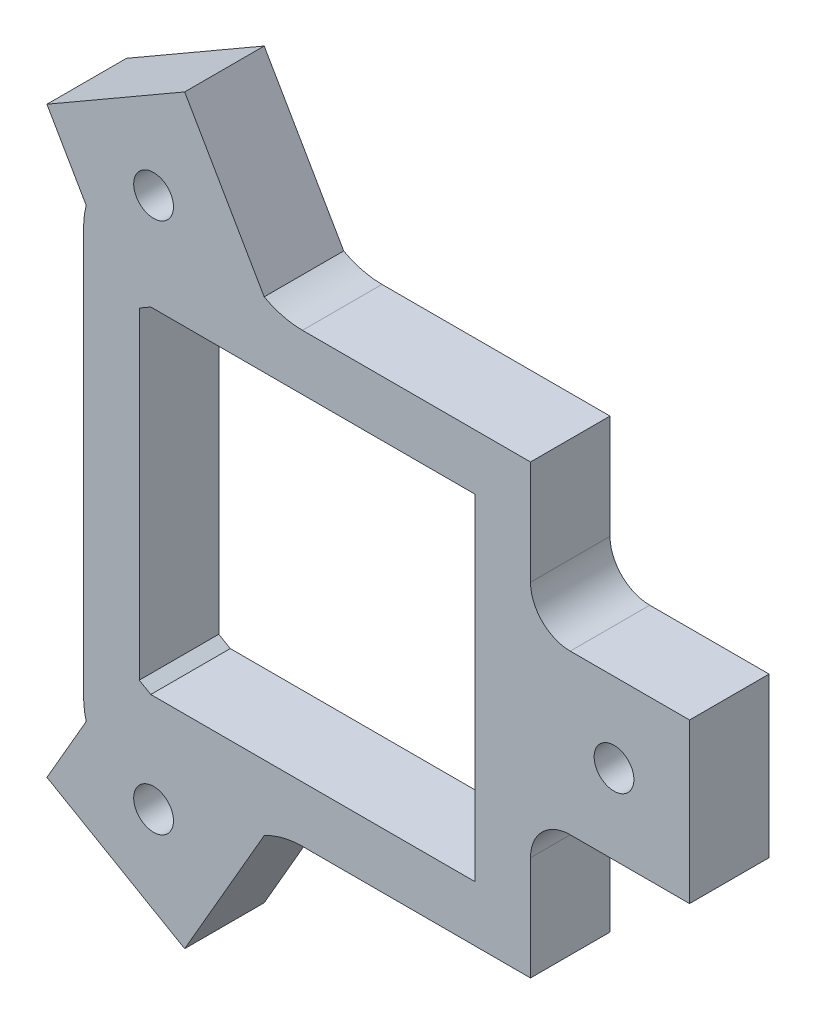
ISO-10303-21;
HEADER;
FILE_DESCRIPTION(('STEP AP214'),'2;1');
FILE_NAME('part.step','',(''),(''),'','','');
FILE_SCHEMA(('AUTOMOTIVE_DESIGN { 1 0 10303 214 1 1 1 1 }'));
ENDSEC;
DATA;
#1=APPLICATION_CONTEXT('core data for automotive mechanical design processes');
#2=APPLICATION_PROTOCOL_DEFINITION('international standard','automotive_design',2000,#1);
#3=PRODUCT_CONTEXT('',#1,'mechanical');
#4=PRODUCT('Part','Part','',(#3));
#5=PRODUCT_RELATED_PRODUCT_CATEGORY('part','',(#4));
#6=PRODUCT_DEFINITION_FORMATION('','',#4);
#7=PRODUCT_DEFINITION_CONTEXT('part definition',#1,'design');
#8=PRODUCT_DEFINITION('design','',#6,#7);
#9=PRODUCT_DEFINITION_SHAPE('','',#8);
#10=(LENGTH_UNIT() NAMED_UNIT(*) SI_UNIT(.MILLI.,.METRE.));
#11=(NAMED_UNIT(*) PLANE_ANGLE_UNIT() SI_UNIT($,.RADIAN.));
#12=(NAMED_UNIT(*) SI_UNIT($,.STERADIAN.) SOLID_ANGLE_UNIT());
#13=UNCERTAINTY_MEASURE_WITH_UNIT(LENGTH_MEASURE(1.E-05),#10,'distance_accuracy_value','');
#14=(GEOMETRIC_REPRESENTATION_CONTEXT(3) GLOBAL_UNCERTAINTY_ASSIGNED_CONTEXT((#13)) GLOBAL_UNIT_ASSIGNED_CONTEXT((#10,
#11,#12)) REPRESENTATION_CONTEXT('',''));
#15=CARTESIAN_POINT('',(0.,0.,0.));
#16=DIRECTION('',(0.,0.,1.));
#17=DIRECTION('',(1.,0.,0.));
#18=AXIS2_PLACEMENT_3D('',#15,#16,#17);
#19=CARTESIAN_POINT('',(0.,0.,10.));
#20=DIRECTION('',(1.,0.,0.));
#21=DIRECTION('',(0.,0.,-1.));
#22=AXIS2_PLACEMENT_3D('',#19,#20,#21);
#23=PLANE('',#22);
#24=DIRECTION('',(0.,-1.,0.));
#25=VECTOR('',#24,1.);
#26=CARTESIAN_POINT('',(0.,0.,0.));
#27=LINE('',#26,#25);
#28=CARTESIAN_POINT('',(0.,41.364994448556,0.));
#29=VERTEX_POINT('',#28);
#30=CARTESIAN_POINT('',(0.,0.835005551444166,0.));
#31=VERTEX_POINT('',#30);
#32=EDGE_CURVE('E336',#29,#31,#27,.T.);
#33=ORIENTED_EDGE('',*,*,#32,.F.);
#34=DIRECTION('',(0.,0.,1.));
#35=VECTOR('',#34,1.);
#36=CARTESIAN_POINT('',(0.,41.364994448556,10.));
#37=LINE('',#36,#35);
#38=CARTESIAN_POINT('',(0.,41.364994448556,10.));
#39=VERTEX_POINT('',#38);
#40=EDGE_CURVE('E248',#29,#39,#37,.T.);
#41=ORIENTED_EDGE('',*,*,#40,.T.);
#42=DIRECTION('',(0.,-1.,0.));
#43=VECTOR('',#42,1.);
#44=CARTESIAN_POINT('',(0.,0.,10.));
#45=LINE('',#44,#43);
#46=CARTESIAN_POINT('',(0.,0.835005551444166,10.));
#47=VERTEX_POINT('',#46);
#48=EDGE_CURVE('E337',#39,#47,#45,.T.);
#49=ORIENTED_EDGE('',*,*,#48,.T.);
#50=DIRECTION('',(0.,0.,-1.));
#51=VECTOR('',#50,1.);
#52=CARTESIAN_POINT('',(0.,0.835005551444163,10.));
#53=LINE('',#52,#51);
#54=EDGE_CURVE('E299',#47,#31,#53,.T.);
#55=ORIENTED_EDGE('',*,*,#54,.T.);
#56=EDGE_LOOP('',(#33,#41,#49,#55));
#57=FACE_BOUND('',#56,.T.);
#58=ADVANCED_FACE('F42',(#57),#23,.T.);
#59=CARTESIAN_POINT('',(-7.,49.2,10.));
#60=DIRECTION('',(0.,-1.,0.));
#61=DIRECTION('',(0.,0.,-1.));
#62=AXIS2_PLACEMENT_3D('',#59,#60,#61);
#63=PLANE('',#62);
#64=DIRECTION('',(-1.,0.,0.));
#65=VECTOR('',#64,1.);
#66=CARTESIAN_POINT('',(-7.,49.2,0.));
#67=LINE('',#66,#65);
#68=CARTESIAN_POINT('',(49.2,49.2,0.));
#69=VERTEX_POINT('',#68);
#70=CARTESIAN_POINT('',(20.5248440128985,49.2,0.));
#71=VERTEX_POINT('',#70);
#72=EDGE_CURVE('E376',#69,#71,#67,.T.);
#73=ORIENTED_EDGE('',*,*,#72,.T.);
#74=DIRECTION('',(0.,0.,1.));
#75=VECTOR('',#74,1.);
#76=CARTESIAN_POINT('',(20.5248440128985,49.2,10.));
#77=LINE('',#76,#75);
#78=CARTESIAN_POINT('',(20.5248440128985,49.2,10.));
#79=VERTEX_POINT('',#78);
#80=EDGE_CURVE('E425',#71,#79,#77,.T.);
#81=ORIENTED_EDGE('',*,*,#80,.T.);
#82=DIRECTION('',(-1.,0.,0.));
#83=VECTOR('',#82,1.);
#84=CARTESIAN_POINT('',(-7.,49.2,10.));
#85=LINE('',#84,#83);
#86=CARTESIAN_POINT('',(49.2,49.2,10.));
#87=VERTEX_POINT('',#86);
#88=EDGE_CURVE('E383',#87,#79,#85,.T.);
#89=ORIENTED_EDGE('',*,*,#88,.F.);
#90=DIRECTION('',(0.,0.,-1.));
#91=VECTOR('',#90,1.);
#92=CARTESIAN_POINT('',(49.2,49.2,10.));
#93=LINE('',#92,#91);
#94=EDGE_CURVE('E386',#87,#69,#93,.T.);
#95=ORIENTED_EDGE('',*,*,#94,.T.);
#96=EDGE_LOOP('',(#73,#81,#89,#95));
#97=FACE_BOUND('',#96,.T.);
#98=ADVANCED_FACE('F502',(#97),#63,.F.);
#99=CARTESIAN_POINT('',(0.,42.2,10.));
#100=DIRECTION('',(0.,-1.,0.));
#101=DIRECTION('',(0.,0.,-1.));
#102=AXIS2_PLACEMENT_3D('',#99,#100,#101);
#103=PLANE('',#102);
#104=DIRECTION('',(-1.,0.,0.));
#105=VECTOR('',#104,1.);
#106=CARTESIAN_POINT('',(0.,42.2,10.));
#107=LINE('',#106,#105);
#108=CARTESIAN_POINT('',(42.2,42.2,10.));
#109=VERTEX_POINT('',#108);
#110=CARTESIAN_POINT('',(1.44627203970319,42.2,10.));
#111=VERTEX_POINT('',#110);
#112=EDGE_CURVE('E348',#109,#111,#107,.T.);
#113=ORIENTED_EDGE('',*,*,#112,.T.);
#114=DIRECTION('',(0.,0.,-1.));
#115=VECTOR('',#114,1.);
#116=CARTESIAN_POINT('',(1.44627203970319,42.2,10.));
#117=LINE('',#116,#115);
#118=CARTESIAN_POINT('',(1.44627203970319,42.2,0.));
#119=VERTEX_POINT('',#118);
#120=EDGE_CURVE('E418',#111,#119,#117,.T.);
#121=ORIENTED_EDGE('',*,*,#120,.T.);
#122=DIRECTION('',(-1.,0.,0.));
#123=VECTOR('',#122,1.);
#124=CARTESIAN_POINT('',(0.,42.2,0.));
#125=LINE('',#124,#123);
#126=CARTESIAN_POINT('',(42.2,42.2,0.));
#127=VERTEX_POINT('',#126);
#128=EDGE_CURVE('E341',#127,#119,#125,.T.);
#129=ORIENTED_EDGE('',*,*,#128,.F.);
#130=DIRECTION('',(0.,0.,-1.));
#131=VECTOR('',#130,1.);
#132=CARTESIAN_POINT('',(42.2,42.2,10.));
#133=LINE('',#132,#131);
#134=EDGE_CURVE('E352',#109,#127,#133,.T.);
#135=ORIENTED_EDGE('',*,*,#134,.F.);
#136=EDGE_LOOP('',(#113,#121,#129,#135));
#137=FACE_BOUND('',#136,.T.);
#138=ADVANCED_FACE('F595',(#137),#103,.T.);
#139=CARTESIAN_POINT('',(-6.99999999999999,-7.,10.));
#140=DIRECTION('',(0.,1.,0.));
#141=DIRECTION('',(0.,0.,1.));
#142=AXIS2_PLACEMENT_3D('',#139,#140,#141);
#143=PLANE('',#142);
#144=DIRECTION('',(1.,0.,0.));
#145=VECTOR('',#144,1.);
#146=CARTESIAN_POINT('',(-6.99999999999999,-7.,10.));
#147=LINE('',#146,#145);
#148=CARTESIAN_POINT('',(20.524844012898,-7.,10.));
#149=VERTEX_POINT('',#148);
#150=CARTESIAN_POINT('',(49.2,-7.,10.));
#151=VERTEX_POINT('',#150);
#152=EDGE_CURVE('E375',#149,#151,#147,.T.);
#153=ORIENTED_EDGE('',*,*,#152,.F.);
#154=DIRECTION('',(0.,0.,-1.));
#155=VECTOR('',#154,1.);
#156=CARTESIAN_POINT('',(20.524844012898,-7.,10.));
#157=LINE('',#156,#155);
#158=CARTESIAN_POINT('',(20.524844012898,-7.,0.));
#159=VERTEX_POINT('',#158);
#160=EDGE_CURVE('E453',#149,#159,#157,.T.);
#161=ORIENTED_EDGE('',*,*,#160,.T.);
#162=DIRECTION('',(1.,0.,0.));
#163=VECTOR('',#162,1.);
#164=CARTESIAN_POINT('',(-6.99999999999999,-7.,0.));
#165=LINE('',#164,#163);
#166=CARTESIAN_POINT('',(49.2,-7.,0.));
#167=VERTEX_POINT('',#166);
#168=EDGE_CURVE('E390',#159,#167,#165,.T.);
#169=ORIENTED_EDGE('',*,*,#168,.T.);
#170=DIRECTION('',(0.,0.,-1.));
#171=VECTOR('',#170,1.);
#172=CARTESIAN_POINT('',(49.2,-7.,10.));
#173=LINE('',#172,#171);
#174=EDGE_CURVE('E403',#151,#167,#173,.T.);
#175=ORIENTED_EDGE('',*,*,#174,.F.);
#176=EDGE_LOOP('',(#153,#161,#169,#175));
#177=FACE_BOUND('',#176,.T.);
#178=ADVANCED_FACE('F561',(#177),#143,.F.);
#179=CARTESIAN_POINT('',(0.,0.,10.));
#180=DIRECTION('',(0.,1.,0.));
#181=DIRECTION('',(0.,0.,1.));
#182=AXIS2_PLACEMENT_3D('',#179,#180,#181);
#183=PLANE('',#182);
#184=DIRECTION('',(1.,0.,0.));
#185=VECTOR('',#184,1.);
#186=CARTESIAN_POINT('',(0.,0.,0.));
#187=LINE('',#186,#185);
#188=CARTESIAN_POINT('',(1.44627203970334,0.,0.));
#189=VERTEX_POINT('',#188);
#190=CARTESIAN_POINT('',(42.2,0.,0.));
#191=VERTEX_POINT('',#190);
#192=EDGE_CURVE('E355',#189,#191,#187,.T.);
#193=ORIENTED_EDGE('',*,*,#192,.F.);
#194=DIRECTION('',(0.,0.,1.));
#195=VECTOR('',#194,1.);
#196=CARTESIAN_POINT('',(1.44627203970334,0.,10.));
#197=LINE('',#196,#195);
#198=CARTESIAN_POINT('',(1.44627203970334,0.,10.));
#199=VERTEX_POINT('',#198);
#200=EDGE_CURVE('E407',#189,#199,#197,.T.);
#201=ORIENTED_EDGE('',*,*,#200,.T.);
#202=DIRECTION('',(1.,0.,0.));
#203=VECTOR('',#202,1.);
#204=CARTESIAN_POINT('',(0.,0.,10.));
#205=LINE('',#204,#203);
#206=CARTESIAN_POINT('',(42.2,0.,10.));
#207=VERTEX_POINT('',#206);
#208=EDGE_CURVE('E340',#199,#207,#205,.T.);
#209=ORIENTED_EDGE('',*,*,#208,.T.);
#210=DIRECTION('',(0.,0.,-1.));
#211=VECTOR('',#210,1.);
#212=CARTESIAN_POINT('',(42.2,0.,10.));
#213=LINE('',#212,#211);
#214=EDGE_CURVE('E367',#207,#191,#213,.T.);
#215=ORIENTED_EDGE('',*,*,#214,.T.);
#216=EDGE_LOOP('',(#193,#201,#209,#215));
#217=FACE_BOUND('',#216,.T.);
#218=ADVANCED_FACE('F600',(#217),#183,.T.);
#219=CARTESIAN_POINT('',(49.2,49.2,10.));
#220=DIRECTION('',(-1.,0.,0.));
#221=DIRECTION('',(0.,-1.,0.));
#222=AXIS2_PLACEMENT_3D('',#219,#220,#221);
#223=PLANE('',#222);
#224=DIRECTION('',(0.,1.,0.));
#225=VECTOR('',#224,1.);
#226=CARTESIAN_POINT('',(49.2,49.2,10.));
#227=LINE('',#226,#225);
#228=CARTESIAN_POINT('',(49.2,36.1,10.));
#229=VERTEX_POINT('',#228);
#230=EDGE_CURVE('E379',#229,#87,#227,.T.);
#231=ORIENTED_EDGE('',*,*,#230,.F.);
#232=DIRECTION('',(0.,0.,1.));
#233=VECTOR('',#232,1.);
#234=CARTESIAN_POINT('',(49.2,36.1,0.));
#235=LINE('',#234,#233);
#236=CARTESIAN_POINT('',(49.2,36.1,0.));
#237=VERTEX_POINT('',#236);
#238=EDGE_CURVE('E475',#229,#237,#235,.F.);
#239=ORIENTED_EDGE('',*,*,#238,.T.);
#240=DIRECTION('',(0.,1.,0.));
#241=VECTOR('',#240,1.);
#242=CARTESIAN_POINT('',(49.2,49.2,0.));
#243=LINE('',#242,#241);
#244=EDGE_CURVE('E393',#237,#69,#243,.T.);
#245=ORIENTED_EDGE('',*,*,#244,.T.);
#246=ORIENTED_EDGE('',*,*,#94,.F.);
#247=EDGE_LOOP('',(#231,#239,#245,#246));
#248=FACE_BOUND('',#247,.T.);
#249=ADVANCED_FACE('F496',(#248),#223,.F.);
#250=CARTESIAN_POINT('',(49.2,6.1,0.));
#251=VERTEX_POINT('',#250);
#252=EDGE_CURVE('E394',#167,#251,#243,.T.);
#253=ORIENTED_EDGE('',*,*,#252,.T.);
#254=DIRECTION('',(0.,0.,-1.));
#255=VECTOR('',#254,1.);
#256=CARTESIAN_POINT('',(49.2,6.1,10.));
#257=LINE('',#256,#255);
#258=CARTESIAN_POINT('',(49.2,6.1,10.));
#259=VERTEX_POINT('',#258);
#260=EDGE_CURVE('E64',#251,#259,#257,.F.);
#261=ORIENTED_EDGE('',*,*,#260,.T.);
#262=EDGE_CURVE('E380',#151,#259,#227,.T.);
#263=ORIENTED_EDGE('',*,*,#262,.F.);
#264=ORIENTED_EDGE('',*,*,#174,.T.);
#265=EDGE_LOOP('',(#253,#261,#263,#264));
#266=FACE_BOUND('',#265,.T.);
#267=ADVANCED_FACE('F563',(#266),#223,.F.);
#268=CARTESIAN_POINT('',(0.,0.,10.));
#269=DIRECTION('',(0.,0.,1.));
#270=DIRECTION('',(1.,0.,0.));
#271=AXIS2_PLACEMENT_3D('',#268,#269,#270);
#272=PLANE('',#271);
#273=CARTESIAN_POINT('',(1.79999999999985,-12.3285805860793,10.));
#274=DIRECTION('',(0.,0.,1.));
#275=DIRECTION('',(-0.500000000000004,-0.866025403784436,0.));
#276=AXIS2_PLACEMENT_3D('',#273,#274,#275);
#277=CIRCLE('',#276,2.5);
#278=CARTESIAN_POINT('',(0.549999999999835,-14.4936440955404,10.));
#279=VERTEX_POINT('',#278);
#280=EDGE_CURVE('E431',#279,#279,#277,.T.);
#281=ORIENTED_EDGE('',*,*,#280,.F.);
#282=EDGE_LOOP('',(#281));
#283=FACE_BOUND('',#282,.T.);
#284=CARTESIAN_POINT('',(1.80000000000031,54.5285805860795,10.));
#285=DIRECTION('',(0.,0.,1.));
#286=DIRECTION('',(-0.499999999999992,0.866025403784443,0.));
#287=AXIS2_PLACEMENT_3D('',#284,#285,#286);
#288=CIRCLE('',#287,2.5);
#289=CARTESIAN_POINT('',(0.550000000000327,56.6936440955406,10.));
#290=VERTEX_POINT('',#289);
#291=EDGE_CURVE('E946',#290,#290,#288,.T.);
#292=ORIENTED_EDGE('',*,*,#291,.F.);
#293=EDGE_LOOP('',(#292));
#294=FACE_BOUND('',#293,.T.);
#295=ORIENTED_EDGE('',*,*,#48,.F.);
#296=DIRECTION('',(0.866025403784443,0.499999999999992,0.));
#297=VECTOR('',#296,1.);
#298=CARTESIAN_POINT('',(-1.61025403784421,40.4353138463429,10.));
#299=LINE('',#298,#297);
#300=EDGE_CURVE('E435',#39,#111,#299,.T.);
#301=ORIENTED_EDGE('',*,*,#300,.T.);
#302=ORIENTED_EDGE('',*,*,#112,.F.);
#303=DIRECTION('',(0.,1.,0.));
#304=VECTOR('',#303,1.);
#305=CARTESIAN_POINT('',(42.2,0.,10.));
#306=LINE('',#305,#304);
#307=EDGE_CURVE('E344',#207,#109,#306,.T.);
#308=ORIENTED_EDGE('',*,*,#307,.F.);
#309=ORIENTED_EDGE('',*,*,#208,.F.);
#310=DIRECTION('',(-0.866025403784437,0.500000000000004,0.));
#311=VECTOR('',#310,1.);
#312=CARTESIAN_POINT('',(15.7102540378443,-8.23531384634271,10.));
#313=LINE('',#312,#311);
#314=EDGE_CURVE('E253',#199,#47,#313,.T.);
#315=ORIENTED_EDGE('',*,*,#314,.T.);
#316=EDGE_LOOP('',(#295,#301,#302,#308,#309,#315));
#317=FACE_BOUND('',#316,.T.);
#318=DIRECTION('',(0.,-1.,0.));
#319=VECTOR('',#318,1.);
#320=CARTESIAN_POINT('',(-7.,49.2,10.));
#321=LINE('',#320,#319);
#322=CARTESIAN_POINT('',(-7.,46.6543169119007,10.));
#323=VERTEX_POINT('',#322);
#324=CARTESIAN_POINT('',(-6.99999999999999,-4.45431691190305,10.));
#325=VERTEX_POINT('',#324);
#326=EDGE_CURVE('E372',#323,#325,#321,.T.);
#327=ORIENTED_EDGE('',*,*,#326,.T.);
#328=CARTESIAN_POINT('',(3.00000000000001,-4.45431691190305,10.));
#329=DIRECTION('',(0.,0.,1.));
#330=DIRECTION('',(1.,0.,0.));
#331=AXIS2_PLACEMENT_3D('',#328,#329,#330);
#332=CIRCLE('',#331,10.);
#333=CARTESIAN_POINT('',(-6.6705479480212,-7.,10.));
#334=VERTEX_POINT('',#333);
#335=EDGE_CURVE('E462',#325,#334,#332,.T.);
#336=ORIENTED_EDGE('',*,*,#335,.T.);
#337=DIRECTION('',(0.500000000000004,0.866025403784436,0.));
#338=VECTOR('',#337,1.);
#339=CARTESIAN_POINT('',(-11.6102540378446,-15.5558219220314,10.));
#340=LINE('',#339,#338);
#341=CARTESIAN_POINT('',(-11.6102540378446,-15.5558219220314,10.));
#342=VERTEX_POINT('',#341);
#343=EDGE_CURVE('E295',#342,#334,#340,.T.);
#344=ORIENTED_EDGE('',*,*,#343,.F.);
#345=DIRECTION('',(-0.866025403784437,0.500000000000004,0.));
#346=VECTOR('',#345,1.);
#347=CARTESIAN_POINT('',(5.71025403784418,-25.5558219220314,10.));
#348=LINE('',#347,#346);
#349=CARTESIAN_POINT('',(5.71025403784418,-25.5558219220314,10.));
#350=VERTEX_POINT('',#349);
#351=EDGE_CURVE('E259',#350,#342,#348,.T.);
#352=ORIENTED_EDGE('',*,*,#351,.F.);
#353=DIRECTION('',(0.500000000000004,0.866025403784436,0.));
#354=VECTOR('',#353,1.);
#355=CARTESIAN_POINT('',(5.71025403784418,-25.5558219220314,10.));
#356=LINE('',#355,#354);
#357=CARTESIAN_POINT('',(15.7102540378443,-8.23531384634271,10.));
#358=VERTEX_POINT('',#357);
#359=EDGE_CURVE('E273',#350,#358,#356,.T.);
#360=ORIENTED_EDGE('',*,*,#359,.T.);
#361=CARTESIAN_POINT('',(20.524844012898,-17.,10.));
#362=DIRECTION('',(0.,0.,1.));
#363=DIRECTION('',(1.,0.,0.));
#364=AXIS2_PLACEMENT_3D('',#361,#362,#363);
#365=CIRCLE('',#364,10.);
#366=EDGE_CURVE('E465',#358,#149,#365,.F.);
#367=ORIENTED_EDGE('',*,*,#366,.T.);
#368=ORIENTED_EDGE('',*,*,#152,.T.);
#369=ORIENTED_EDGE('',*,*,#262,.T.);
#370=CARTESIAN_POINT('',(54.2,6.1,10.));
#371=DIRECTION('',(0.,0.,1.));
#372=DIRECTION('',(1.,0.,0.));
#373=AXIS2_PLACEMENT_3D('',#370,#371,#372);
#374=CIRCLE('',#373,5.);
#375=CARTESIAN_POINT('',(54.2,11.1,10.));
#376=VERTEX_POINT('',#375);
#377=EDGE_CURVE('E11',#259,#376,#374,.F.);
#378=ORIENTED_EDGE('',*,*,#377,.T.);
#379=DIRECTION('',(-1.,0.,0.));
#380=VECTOR('',#379,1.);
#381=CARTESIAN_POINT('',(69.2,11.1,10.));
#382=LINE('',#381,#380);
#383=CARTESIAN_POINT('',(69.2,11.1,10.));
#384=VERTEX_POINT('',#383);
#385=EDGE_CURVE('E332',#384,#376,#382,.T.);
#386=ORIENTED_EDGE('',*,*,#385,.F.);
#387=DIRECTION('',(0.,-1.,0.));
#388=VECTOR('',#387,1.);
#389=CARTESIAN_POINT('',(69.2,31.1,10.));
#390=LINE('',#389,#388);
#391=CARTESIAN_POINT('',(69.2,31.1,10.));
#392=VERTEX_POINT('',#391);
#393=EDGE_CURVE('E308',#392,#384,#390,.T.);
#394=ORIENTED_EDGE('',*,*,#393,.F.);
#395=DIRECTION('',(-1.,0.,0.));
#396=VECTOR('',#395,1.);
#397=CARTESIAN_POINT('',(69.2,31.1,10.));
#398=LINE('',#397,#396);
#399=CARTESIAN_POINT('',(54.2,31.1,10.));
#400=VERTEX_POINT('',#399);
#401=EDGE_CURVE('E321',#392,#400,#398,.T.);
#402=ORIENTED_EDGE('',*,*,#401,.T.);
#403=CARTESIAN_POINT('',(54.2,36.1,10.));
#404=DIRECTION('',(0.,0.,1.));
#405=DIRECTION('',(1.,0.,0.));
#406=AXIS2_PLACEMENT_3D('',#403,#404,#405);
#407=CIRCLE('',#406,5.);
#408=EDGE_CURVE('E484',#400,#229,#407,.F.);
#409=ORIENTED_EDGE('',*,*,#408,.T.);
#410=ORIENTED_EDGE('',*,*,#230,.T.);
#411=ORIENTED_EDGE('',*,*,#88,.T.);
#412=CARTESIAN_POINT('',(20.5248440128985,59.2,10.));
#413=DIRECTION('',(0.,0.,1.));
#414=DIRECTION('',(1.,0.,0.));
#415=AXIS2_PLACEMENT_3D('',#412,#413,#414);
#416=CIRCLE('',#415,10.);
#417=CARTESIAN_POINT('',(15.7102540378447,50.4353138463428,10.));
#418=VERTEX_POINT('',#417);
#419=EDGE_CURVE('E246',#79,#418,#416,.F.);
#420=ORIENTED_EDGE('',*,*,#419,.T.);
#421=DIRECTION('',(0.499999999999992,-0.866025403784443,0.));
#422=VECTOR('',#421,1.);
#423=CARTESIAN_POINT('',(5.71025403784481,67.7558219220317,10.));
#424=LINE('',#423,#422);
#425=CARTESIAN_POINT('',(5.71025403784481,67.7558219220317,10.));
#426=VERTEX_POINT('',#425);
#427=EDGE_CURVE('E221',#426,#418,#424,.T.);
#428=ORIENTED_EDGE('',*,*,#427,.F.);
#429=DIRECTION('',(0.866025403784443,0.499999999999992,0.));
#430=VECTOR('',#429,1.);
#431=CARTESIAN_POINT('',(-11.610254037844,57.7558219220318,10.));
#432=LINE('',#431,#430);
#433=CARTESIAN_POINT('',(-11.610254037844,57.7558219220318,10.));
#434=VERTEX_POINT('',#433);
#435=EDGE_CURVE('E229',#434,#426,#432,.T.);
#436=ORIENTED_EDGE('',*,*,#435,.F.);
#437=DIRECTION('',(0.499999999999992,-0.866025403784443,0.));
#438=VECTOR('',#437,1.);
#439=CARTESIAN_POINT('',(-11.610254037844,57.7558219220318,10.));
#440=LINE('',#439,#438);
#441=CARTESIAN_POINT('',(-6.6705479480206,49.2,10.));
#442=VERTEX_POINT('',#441);
#443=EDGE_CURVE('E519',#434,#442,#440,.T.);
#444=ORIENTED_EDGE('',*,*,#443,.T.);
#445=CARTESIAN_POINT('',(3.,46.6543169119007,10.));
#446=DIRECTION('',(0.,0.,1.));
#447=DIRECTION('',(1.,0.,0.));
#448=AXIS2_PLACEMENT_3D('',#445,#446,#447);
#449=CIRCLE('',#448,10.);
#450=EDGE_CURVE('E450',#442,#323,#449,.T.);
#451=ORIENTED_EDGE('',*,*,#450,.T.);
#452=EDGE_LOOP('',(#327,#336,#344,#352,#360,#367,#368,#369,#378,#386,#394,#402,#409,#410,#411,
#420,#428,#436,#444,#451));
#453=FACE_BOUND('',#452,.T.);
#454=CARTESIAN_POINT('',(59.7,21.1,10.));
#455=DIRECTION('',(0.,0.,1.));
#456=DIRECTION('',(1.,0.,0.));
#457=AXIS2_PLACEMENT_3D('',#454,#455,#456);
#458=CIRCLE('',#457,2.5);
#459=CARTESIAN_POINT('',(62.2,21.1,10.));
#460=VERTEX_POINT('',#459);
#461=EDGE_CURVE('E303',#460,#460,#458,.T.);
#462=ORIENTED_EDGE('',*,*,#461,.F.);
#463=EDGE_LOOP('',(#462));
#464=FACE_BOUND('',#463,.T.);
#465=ADVANCED_FACE('F242',(#283,#294,#317,#453,#464),#272,.T.);
#466=CARTESIAN_POINT('',(0.,0.,0.));
#467=DIRECTION('',(0.,0.,1.));
#468=DIRECTION('',(1.,0.,0.));
#469=AXIS2_PLACEMENT_3D('',#466,#467,#468);
#470=PLANE('',#469);
#471=CARTESIAN_POINT('',(1.79999999999985,-12.3285805860793,0.));
#472=DIRECTION('',(0.,0.,1.));
#473=DIRECTION('',(1.,0.,0.));
#474=AXIS2_PLACEMENT_3D('',#471,#472,#473);
#475=CIRCLE('',#474,2.5);
#476=CARTESIAN_POINT('',(4.29999999999985,-12.3285805860793,0.));
#477=VERTEX_POINT('',#476);
#478=EDGE_CURVE('E430',#477,#477,#475,.T.);
#479=ORIENTED_EDGE('',*,*,#478,.T.);
#480=EDGE_LOOP('',(#479));
#481=FACE_BOUND('',#480,.T.);
#482=CARTESIAN_POINT('',(1.80000000000031,54.5285805860795,0.));
#483=DIRECTION('',(0.,0.,1.));
#484=DIRECTION('',(1.,0.,0.));
#485=AXIS2_PLACEMENT_3D('',#482,#483,#484);
#486=CIRCLE('',#485,2.5);
#487=CARTESIAN_POINT('',(4.30000000000031,54.5285805860795,0.));
#488=VERTEX_POINT('',#487);
#489=EDGE_CURVE('E426',#488,#488,#486,.T.);
#490=ORIENTED_EDGE('',*,*,#489,.T.);
#491=EDGE_LOOP('',(#490));
#492=FACE_BOUND('',#491,.T.);
#493=DIRECTION('',(-0.866025403784443,-0.499999999999992,0.));
#494=VECTOR('',#493,1.);
#495=CARTESIAN_POINT('',(-1.61025403784421,40.4353138463429,0.));
#496=LINE('',#495,#494);
#497=EDGE_CURVE('E239',#119,#29,#496,.T.);
#498=ORIENTED_EDGE('',*,*,#497,.T.);
#499=ORIENTED_EDGE('',*,*,#32,.T.);
#500=DIRECTION('',(0.866025403784437,-0.500000000000004,0.));
#501=VECTOR('',#500,1.);
#502=CARTESIAN_POINT('',(15.7102540378443,-8.23531384634271,0.));
#503=LINE('',#502,#501);
#504=EDGE_CURVE('E277',#31,#189,#503,.T.);
#505=ORIENTED_EDGE('',*,*,#504,.T.);
#506=ORIENTED_EDGE('',*,*,#192,.T.);
#507=DIRECTION('',(0.,1.,0.));
#508=VECTOR('',#507,1.);
#509=CARTESIAN_POINT('',(42.2,0.,0.));
#510=LINE('',#509,#508);
#511=EDGE_CURVE('E358',#191,#127,#510,.T.);
#512=ORIENTED_EDGE('',*,*,#511,.T.);
#513=ORIENTED_EDGE('',*,*,#128,.T.);
#514=EDGE_LOOP('',(#498,#499,#505,#506,#512,#513));
#515=FACE_BOUND('',#514,.T.);
#516=DIRECTION('',(0.500000000000004,0.866025403784436,0.));
#517=VECTOR('',#516,1.);
#518=CARTESIAN_POINT('',(-11.6102540378446,-15.5558219220314,0.));
#519=LINE('',#518,#517);
#520=CARTESIAN_POINT('',(-11.6102540378446,-15.5558219220314,0.));
#521=VERTEX_POINT('',#520);
#522=CARTESIAN_POINT('',(-6.6705479480212,-7.,0.));
#523=VERTEX_POINT('',#522);
#524=EDGE_CURVE('E291',#521,#523,#519,.T.);
#525=ORIENTED_EDGE('',*,*,#524,.T.);
#526=CARTESIAN_POINT('',(3.00000000000001,-4.45431691190305,0.));
#527=DIRECTION('',(0.,0.,1.));
#528=DIRECTION('',(1.,0.,0.));
#529=AXIS2_PLACEMENT_3D('',#526,#527,#528);
#530=CIRCLE('',#529,10.);
#531=CARTESIAN_POINT('',(-6.99999999999999,-4.45431691190305,0.));
#532=VERTEX_POINT('',#531);
#533=EDGE_CURVE('E456',#523,#532,#530,.F.);
#534=ORIENTED_EDGE('',*,*,#533,.T.);
#535=DIRECTION('',(0.,-1.,0.));
#536=VECTOR('',#535,1.);
#537=CARTESIAN_POINT('',(-7.,49.2,0.));
#538=LINE('',#537,#536);
#539=CARTESIAN_POINT('',(-7.,46.6543169119007,0.));
#540=VERTEX_POINT('',#539);
#541=EDGE_CURVE('E371',#540,#532,#538,.T.);
#542=ORIENTED_EDGE('',*,*,#541,.F.);
#543=CARTESIAN_POINT('',(3.,46.6543169119007,0.));
#544=DIRECTION('',(0.,0.,1.));
#545=DIRECTION('',(1.,0.,0.));
#546=AXIS2_PLACEMENT_3D('',#543,#544,#545);
#547=CIRCLE('',#546,10.);
#548=CARTESIAN_POINT('',(-6.6705479480206,49.2,0.));
#549=VERTEX_POINT('',#548);
#550=EDGE_CURVE('E447',#540,#549,#547,.F.);
#551=ORIENTED_EDGE('',*,*,#550,.T.);
#552=DIRECTION('',(0.499999999999992,-0.866025403784443,0.));
#553=VECTOR('',#552,1.);
#554=CARTESIAN_POINT('',(-11.610254037844,57.7558219220318,0.));
#555=LINE('',#554,#553);
#556=CARTESIAN_POINT('',(-11.610254037844,57.7558219220318,0.));
#557=VERTEX_POINT('',#556);
#558=EDGE_CURVE('E255',#557,#549,#555,.T.);
#559=ORIENTED_EDGE('',*,*,#558,.F.);
#560=DIRECTION('',(-0.866025403784443,-0.499999999999992,0.));
#561=VECTOR('',#560,1.);
#562=CARTESIAN_POINT('',(-11.610254037844,57.7558219220318,0.));
#563=LINE('',#562,#561);
#564=CARTESIAN_POINT('',(5.71025403784481,67.7558219220317,0.));
#565=VERTEX_POINT('',#564);
#566=EDGE_CURVE('E228',#565,#557,#563,.T.);
#567=ORIENTED_EDGE('',*,*,#566,.F.);
#568=DIRECTION('',(0.499999999999992,-0.866025403784443,0.));
#569=VECTOR('',#568,1.);
#570=CARTESIAN_POINT('',(5.71025403784481,67.7558219220317,0.));
#571=LINE('',#570,#569);
#572=CARTESIAN_POINT('',(15.7102540378447,50.4353138463428,0.));
#573=VERTEX_POINT('',#572);
#574=EDGE_CURVE('E224',#565,#573,#571,.T.);
#575=ORIENTED_EDGE('',*,*,#574,.T.);
#576=CARTESIAN_POINT('',(20.5248440128985,59.2,0.));
#577=DIRECTION('',(0.,0.,1.));
#578=DIRECTION('',(1.,0.,0.));
#579=AXIS2_PLACEMENT_3D('',#576,#577,#578);
#580=CIRCLE('',#579,10.);
#581=EDGE_CURVE('E438',#573,#71,#580,.T.);
#582=ORIENTED_EDGE('',*,*,#581,.T.);
#583=ORIENTED_EDGE('',*,*,#72,.F.);
#584=ORIENTED_EDGE('',*,*,#244,.F.);
#585=CARTESIAN_POINT('',(54.2,36.1,0.));
#586=DIRECTION('',(0.,0.,1.));
#587=DIRECTION('',(1.,0.,0.));
#588=AXIS2_PLACEMENT_3D('',#585,#586,#587);
#589=CIRCLE('',#588,5.);
#590=CARTESIAN_POINT('',(54.2,31.1,0.));
#591=VERTEX_POINT('',#590);
#592=EDGE_CURVE('E487',#237,#591,#589,.T.);
#593=ORIENTED_EDGE('',*,*,#592,.T.);
#594=DIRECTION('',(-1.,0.,0.));
#595=VECTOR('',#594,1.);
#596=CARTESIAN_POINT('',(69.2,31.1,0.));
#597=LINE('',#596,#595);
#598=CARTESIAN_POINT('',(69.2,31.1,0.));
#599=VERTEX_POINT('',#598);
#600=EDGE_CURVE('E325',#599,#591,#597,.T.);
#601=ORIENTED_EDGE('',*,*,#600,.F.);
#602=DIRECTION('',(0.,1.,0.));
#603=VECTOR('',#602,1.);
#604=CARTESIAN_POINT('',(69.2,31.1,0.));
#605=LINE('',#604,#603);
#606=CARTESIAN_POINT('',(69.2,11.1,0.));
#607=VERTEX_POINT('',#606);
#608=EDGE_CURVE('E315',#607,#599,#605,.T.);
#609=ORIENTED_EDGE('',*,*,#608,.F.);
#610=DIRECTION('',(-1.,0.,0.));
#611=VECTOR('',#610,1.);
#612=CARTESIAN_POINT('',(69.2,11.1,0.));
#613=LINE('',#612,#611);
#614=CARTESIAN_POINT('',(54.2,11.1,0.));
#615=VERTEX_POINT('',#614);
#616=EDGE_CURVE('E329',#607,#615,#613,.T.);
#617=ORIENTED_EDGE('',*,*,#616,.T.);
#618=CARTESIAN_POINT('',(54.2,6.1,0.));
#619=DIRECTION('',(0.,0.,1.));
#620=DIRECTION('',(1.,0.,0.));
#621=AXIS2_PLACEMENT_3D('',#618,#619,#620);
#622=CIRCLE('',#621,5.);
#623=EDGE_CURVE('E51',#615,#251,#622,.T.);
#624=ORIENTED_EDGE('',*,*,#623,.T.);
#625=ORIENTED_EDGE('',*,*,#252,.F.);
#626=ORIENTED_EDGE('',*,*,#168,.F.);
#627=CARTESIAN_POINT('',(20.524844012898,-17.,0.));
#628=DIRECTION('',(0.,0.,1.));
#629=DIRECTION('',(1.,0.,0.));
#630=AXIS2_PLACEMENT_3D('',#627,#628,#629);
#631=CIRCLE('',#630,10.);
#632=CARTESIAN_POINT('',(15.7102540378443,-8.23531384634271,0.));
#633=VERTEX_POINT('',#632);
#634=EDGE_CURVE('E468',#159,#633,#631,.T.);
#635=ORIENTED_EDGE('',*,*,#634,.T.);
#636=DIRECTION('',(0.500000000000004,0.866025403784436,0.));
#637=VECTOR('',#636,1.);
#638=CARTESIAN_POINT('',(5.71025403784418,-25.5558219220314,0.));
#639=LINE('',#638,#637);
#640=CARTESIAN_POINT('',(5.71025403784418,-25.5558219220314,0.));
#641=VERTEX_POINT('',#640);
#642=EDGE_CURVE('E287',#641,#633,#639,.T.);
#643=ORIENTED_EDGE('',*,*,#642,.F.);
#644=DIRECTION('',(0.866025403784437,-0.500000000000004,0.));
#645=VECTOR('',#644,1.);
#646=CARTESIAN_POINT('',(5.71025403784418,-25.5558219220314,0.));
#647=LINE('',#646,#645);
#648=EDGE_CURVE('E267',#521,#641,#647,.T.);
#649=ORIENTED_EDGE('',*,*,#648,.F.);
#650=EDGE_LOOP('',(#525,#534,#542,#551,#559,#567,#575,#582,#583,#584,#593,#601,#609,#617,#624,
#625,#626,#635,#643,#649));
#651=FACE_BOUND('',#650,.T.);
#652=CARTESIAN_POINT('',(59.7,21.1,0.));
#653=DIRECTION('',(0.,0.,1.));
#654=DIRECTION('',(1.,0.,0.));
#655=AXIS2_PLACEMENT_3D('',#652,#653,#654);
#656=CIRCLE('',#655,2.5);
#657=CARTESIAN_POINT('',(62.2,21.1,0.));
#658=VERTEX_POINT('',#657);
#659=EDGE_CURVE('E307',#658,#658,#656,.T.);
#660=ORIENTED_EDGE('',*,*,#659,.T.);
#661=EDGE_LOOP('',(#660));
#662=FACE_BOUND('',#661,.T.);
#663=ADVANCED_FACE('F504',(#481,#492,#515,#651,#662),#470,.F.);
#664=CARTESIAN_POINT('',(-7.,49.2,10.));
#665=DIRECTION('',(1.,0.,0.));
#666=DIRECTION('',(0.,1.,0.));
#667=AXIS2_PLACEMENT_3D('',#664,#665,#666);
#668=PLANE('',#667);
#669=ORIENTED_EDGE('',*,*,#541,.T.);
#670=DIRECTION('',(0.,0.,-1.));
#671=VECTOR('',#670,1.);
#672=CARTESIAN_POINT('',(-6.99999999999999,-4.45431691190305,10.));
#673=LINE('',#672,#671);
#674=EDGE_CURVE('E459',#532,#325,#673,.F.);
#675=ORIENTED_EDGE('',*,*,#674,.T.);
#676=ORIENTED_EDGE('',*,*,#326,.F.);
#677=DIRECTION('',(0.,0.,1.));
#678=VECTOR('',#677,1.);
#679=CARTESIAN_POINT('',(-7.,46.6543169119007,10.));
#680=LINE('',#679,#678);
#681=EDGE_CURVE('E443',#323,#540,#680,.F.);
#682=ORIENTED_EDGE('',*,*,#681,.T.);
#683=EDGE_LOOP('',(#669,#675,#676,#682));
#684=FACE_BOUND('',#683,.T.);
#685=ADVANCED_FACE('F534',(#684),#668,.F.);
#686=CARTESIAN_POINT('',(42.2,0.,10.));
#687=DIRECTION('',(-1.,0.,0.));
#688=DIRECTION('',(0.,0.,1.));
#689=AXIS2_PLACEMENT_3D('',#686,#687,#688);
#690=PLANE('',#689);
#691=ORIENTED_EDGE('',*,*,#511,.F.);
#692=ORIENTED_EDGE('',*,*,#214,.F.);
#693=ORIENTED_EDGE('',*,*,#307,.T.);
#694=ORIENTED_EDGE('',*,*,#134,.T.);
#695=EDGE_LOOP('',(#691,#692,#693,#694));
#696=FACE_BOUND('',#695,.T.);
#697=ADVANCED_FACE('F614',(#696),#690,.T.);
#698=CARTESIAN_POINT('',(69.2,11.1,10.));
#699=DIRECTION('',(0.,1.,0.));
#700=DIRECTION('',(-1.,0.,0.));
#701=AXIS2_PLACEMENT_3D('',#698,#699,#700);
#702=PLANE('',#701);
#703=ORIENTED_EDGE('',*,*,#385,.T.);
#704=DIRECTION('',(0.,0.,-1.));
#705=VECTOR('',#704,1.);
#706=CARTESIAN_POINT('',(54.2,11.1,0.));
#707=LINE('',#706,#705);
#708=EDGE_CURVE('E478',#376,#615,#707,.T.);
#709=ORIENTED_EDGE('',*,*,#708,.T.);
#710=ORIENTED_EDGE('',*,*,#616,.F.);
#711=DIRECTION('',(0.,0.,-1.));
#712=VECTOR('',#711,1.);
#713=CARTESIAN_POINT('',(69.2,11.1,10.));
#714=LINE('',#713,#712);
#715=EDGE_CURVE('E312',#384,#607,#714,.T.);
#716=ORIENTED_EDGE('',*,*,#715,.F.);
#717=EDGE_LOOP('',(#703,#709,#710,#716));
#718=FACE_BOUND('',#717,.T.);
#719=ADVANCED_FACE('F570',(#718),#702,.F.);
#720=CARTESIAN_POINT('',(69.2,31.1,10.));
#721=DIRECTION('',(0.,-1.,0.));
#722=DIRECTION('',(1.,0.,0.));
#723=AXIS2_PLACEMENT_3D('',#720,#721,#722);
#724=PLANE('',#723);
#725=ORIENTED_EDGE('',*,*,#600,.T.);
#726=DIRECTION('',(0.,0.,1.));
#727=VECTOR('',#726,1.);
#728=CARTESIAN_POINT('',(54.2,31.1,10.));
#729=LINE('',#728,#727);
#730=EDGE_CURVE('E471',#591,#400,#729,.T.);
#731=ORIENTED_EDGE('',*,*,#730,.T.);
#732=ORIENTED_EDGE('',*,*,#401,.F.);
#733=DIRECTION('',(0.,0.,1.));
#734=VECTOR('',#733,1.);
#735=CARTESIAN_POINT('',(69.2,31.1,10.));
#736=LINE('',#735,#734);
#737=EDGE_CURVE('E318',#599,#392,#736,.T.);
#738=ORIENTED_EDGE('',*,*,#737,.F.);
#739=EDGE_LOOP('',(#725,#731,#732,#738));
#740=FACE_BOUND('',#739,.T.);
#741=ADVANCED_FACE('F578',(#740),#724,.F.);
#742=CARTESIAN_POINT('',(69.2,0.,0.));
#743=DIRECTION('',(1.,0.,0.));
#744=DIRECTION('',(0.,1.,0.));
#745=AXIS2_PLACEMENT_3D('',#742,#743,#744);
#746=PLANE('',#745);
#747=ORIENTED_EDGE('',*,*,#393,.T.);
#748=ORIENTED_EDGE('',*,*,#715,.T.);
#749=ORIENTED_EDGE('',*,*,#608,.T.);
#750=ORIENTED_EDGE('',*,*,#737,.T.);
#751=EDGE_LOOP('',(#747,#748,#749,#750));
#752=FACE_BOUND('',#751,.T.);
#753=ADVANCED_FACE('F574',(#752),#746,.T.);
#754=CARTESIAN_POINT('',(59.7,21.1,-17.));
#755=DIRECTION('',(0.,0.,1.));
#756=DIRECTION('',(1.,0.,0.));
#757=AXIS2_PLACEMENT_3D('',#754,#755,#756);
#758=CYLINDRICAL_SURFACE('',#757,2.5);
#759=ORIENTED_EDGE('',*,*,#461,.T.);
#760=EDGE_LOOP('',(#759));
#761=FACE_BOUND('',#760,.T.);
#762=ORIENTED_EDGE('',*,*,#659,.F.);
#763=EDGE_LOOP('',(#762));
#764=FACE_BOUND('',#763,.T.);
#765=ADVANCED_FACE('F798',(#761,#764),#758,.F.);
#766=CARTESIAN_POINT('',(-11.2231360198517,7.3146861536574,0.));
#767=DIRECTION('',(-0.500000000000004,-0.866025403784437,0.));
#768=DIRECTION('',(0.866025403784437,-0.500000000000004,0.));
#769=AXIS2_PLACEMENT_3D('',#766,#767,#768);
#770=PLANE('',#769);
#771=ORIENTED_EDGE('',*,*,#54,.F.);
#772=ORIENTED_EDGE('',*,*,#314,.F.);
#773=ORIENTED_EDGE('',*,*,#200,.F.);
#774=ORIENTED_EDGE('',*,*,#504,.F.);
#775=EDGE_LOOP('',(#771,#772,#773,#774));
#776=FACE_BOUND('',#775,.T.);
#777=ADVANCED_FACE('F790',(#776),#770,.F.);
#778=CARTESIAN_POINT('',(-11.6102540378446,-15.5558219220314,10.));
#779=DIRECTION('',(0.866025403784436,-0.500000000000004,0.));
#780=DIRECTION('',(0.500000000000004,0.866025403784436,0.));
#781=AXIS2_PLACEMENT_3D('',#778,#779,#780);
#782=PLANE('',#781);
#783=ORIENTED_EDGE('',*,*,#343,.T.);
#784=DIRECTION('',(0.,0.,-1.));
#785=VECTOR('',#784,1.);
#786=CARTESIAN_POINT('',(-6.6705479480212,-7.,10.));
#787=LINE('',#786,#785);
#788=EDGE_CURVE('E414',#334,#523,#787,.T.);
#789=ORIENTED_EDGE('',*,*,#788,.T.);
#790=ORIENTED_EDGE('',*,*,#524,.F.);
#791=DIRECTION('',(0.,0.,-1.));
#792=VECTOR('',#791,1.);
#793=CARTESIAN_POINT('',(-11.6102540378446,-15.5558219220314,10.));
#794=LINE('',#793,#792);
#795=EDGE_CURVE('E263',#342,#521,#794,.T.);
#796=ORIENTED_EDGE('',*,*,#795,.F.);
#797=EDGE_LOOP('',(#783,#789,#790,#796));
#798=FACE_BOUND('',#797,.T.);
#799=ADVANCED_FACE('F543',(#798),#782,.F.);
#800=CARTESIAN_POINT('',(5.71025403784418,-25.5558219220314,10.));
#801=DIRECTION('',(-0.866025403784436,0.500000000000004,0.));
#802=DIRECTION('',(-0.500000000000004,-0.866025403784436,0.));
#803=AXIS2_PLACEMENT_3D('',#800,#801,#802);
#804=PLANE('',#803);
#805=DIRECTION('',(0.,0.,1.));
#806=VECTOR('',#805,1.);
#807=CARTESIAN_POINT('',(15.7102540378443,-8.23531384634271,10.));
#808=LINE('',#807,#806);
#809=EDGE_CURVE('E264',#633,#358,#808,.T.);
#810=ORIENTED_EDGE('',*,*,#809,.T.);
#811=ORIENTED_EDGE('',*,*,#359,.F.);
#812=DIRECTION('',(0.,0.,1.));
#813=VECTOR('',#812,1.);
#814=CARTESIAN_POINT('',(5.71025403784418,-25.5558219220314,10.));
#815=LINE('',#814,#813);
#816=EDGE_CURVE('E270',#641,#350,#815,.T.);
#817=ORIENTED_EDGE('',*,*,#816,.F.);
#818=ORIENTED_EDGE('',*,*,#642,.T.);
#819=EDGE_LOOP('',(#810,#811,#817,#818));
#820=FACE_BOUND('',#819,.T.);
#821=ADVANCED_FACE('F552',(#820),#804,.F.);
#822=CARTESIAN_POINT('',(-21.2231360198518,-10.0058219220313,0.));
#823=DIRECTION('',(-0.500000000000004,-0.866025403784437,0.));
#824=DIRECTION('',(0.866025403784437,-0.500000000000004,0.));
#825=AXIS2_PLACEMENT_3D('',#822,#823,#824);
#826=PLANE('',#825);
#827=ORIENTED_EDGE('',*,*,#351,.T.);
#828=ORIENTED_EDGE('',*,*,#795,.T.);
#829=ORIENTED_EDGE('',*,*,#648,.T.);
#830=ORIENTED_EDGE('',*,*,#816,.T.);
#831=EDGE_LOOP('',(#827,#828,#829,#830));
#832=FACE_BOUND('',#831,.T.);
#833=ADVANCED_FACE('F547',(#832),#826,.T.);
#834=CARTESIAN_POINT('',(25.323136019852,55.9853138463427,0.));
#835=DIRECTION('',(-0.499999999999992,0.866025403784443,0.));
#836=DIRECTION('',(-0.866025403784443,-0.499999999999992,0.));
#837=AXIS2_PLACEMENT_3D('',#834,#835,#836);
#838=PLANE('',#837);
#839=ORIENTED_EDGE('',*,*,#40,.F.);
#840=ORIENTED_EDGE('',*,*,#497,.F.);
#841=ORIENTED_EDGE('',*,*,#120,.F.);
#842=ORIENTED_EDGE('',*,*,#300,.F.);
#843=EDGE_LOOP('',(#839,#840,#841,#842));
#844=FACE_BOUND('',#843,.T.);
#845=ADVANCED_FACE('F757',(#844),#838,.F.);
#846=CARTESIAN_POINT('',(-11.610254037844,57.7558219220318,10.));
#847=DIRECTION('',(0.866025403784443,0.499999999999992,0.));
#848=DIRECTION('',(-0.499999999999992,0.866025403784443,0.));
#849=AXIS2_PLACEMENT_3D('',#846,#847,#848);
#850=PLANE('',#849);
#851=ORIENTED_EDGE('',*,*,#558,.T.);
#852=DIRECTION('',(0.,0.,1.));
#853=VECTOR('',#852,1.);
#854=CARTESIAN_POINT('',(-6.6705479480206,49.2,10.));
#855=LINE('',#854,#853);
#856=EDGE_CURVE('E422',#549,#442,#855,.T.);
#857=ORIENTED_EDGE('',*,*,#856,.T.);
#858=ORIENTED_EDGE('',*,*,#443,.F.);
#859=DIRECTION('',(0.,0.,1.));
#860=VECTOR('',#859,1.);
#861=CARTESIAN_POINT('',(-11.610254037844,57.7558219220318,10.));
#862=LINE('',#861,#860);
#863=EDGE_CURVE('E234',#557,#434,#862,.T.);
#864=ORIENTED_EDGE('',*,*,#863,.F.);
#865=EDGE_LOOP('',(#851,#857,#858,#864));
#866=FACE_BOUND('',#865,.T.);
#867=ADVANCED_FACE('F526',(#866),#850,.F.);
#868=CARTESIAN_POINT('',(5.71025403784481,67.7558219220317,10.));
#869=DIRECTION('',(-0.866025403784443,-0.499999999999992,0.));
#870=DIRECTION('',(0.499999999999992,-0.866025403784443,0.));
#871=AXIS2_PLACEMENT_3D('',#868,#869,#870);
#872=PLANE('',#871);
#873=DIRECTION('',(0.,0.,-1.));
#874=VECTOR('',#873,1.);
#875=CARTESIAN_POINT('',(15.7102540378447,50.4353138463428,10.));
#876=LINE('',#875,#874);
#877=EDGE_CURVE('E508',#418,#573,#876,.T.);
#878=ORIENTED_EDGE('',*,*,#877,.T.);
#879=ORIENTED_EDGE('',*,*,#574,.F.);
#880=DIRECTION('',(0.,0.,-1.));
#881=VECTOR('',#880,1.);
#882=CARTESIAN_POINT('',(5.71025403784481,67.7558219220317,10.));
#883=LINE('',#882,#881);
#884=EDGE_CURVE('E216',#426,#565,#883,.T.);
#885=ORIENTED_EDGE('',*,*,#884,.F.);
#886=ORIENTED_EDGE('',*,*,#427,.T.);
#887=EDGE_LOOP('',(#878,#879,#885,#886));
#888=FACE_BOUND('',#887,.T.);
#889=ADVANCED_FACE('F219',(#888),#872,.F.);
#890=CARTESIAN_POINT('',(15.3231360198521,73.3058219220316,0.));
#891=DIRECTION('',(-0.499999999999992,0.866025403784443,0.));
#892=DIRECTION('',(-0.866025403784443,-0.499999999999992,0.));
#893=AXIS2_PLACEMENT_3D('',#890,#891,#892);
#894=PLANE('',#893);
#895=ORIENTED_EDGE('',*,*,#435,.T.);
#896=ORIENTED_EDGE('',*,*,#884,.T.);
#897=ORIENTED_EDGE('',*,*,#566,.T.);
#898=ORIENTED_EDGE('',*,*,#863,.T.);
#899=EDGE_LOOP('',(#895,#896,#897,#898));
#900=FACE_BOUND('',#899,.T.);
#901=ADVANCED_FACE('F232',(#900),#894,.T.);
#902=CARTESIAN_POINT('',(1.80000000000031,54.5285805860795,-17.));
#903=DIRECTION('',(0.,0.,1.));
#904=DIRECTION('',(1.,0.,0.));
#905=AXIS2_PLACEMENT_3D('',#902,#903,#904);
#906=CYLINDRICAL_SURFACE('',#905,2.5);
#907=ORIENTED_EDGE('',*,*,#291,.T.);
#908=EDGE_LOOP('',(#907));
#909=FACE_BOUND('',#908,.T.);
#910=ORIENTED_EDGE('',*,*,#489,.F.);
#911=EDGE_LOOP('',(#910));
#912=FACE_BOUND('',#911,.T.);
#913=ADVANCED_FACE('F722',(#909,#912),#906,.F.);
#914=CARTESIAN_POINT('',(1.79999999999985,-12.3285805860793,-17.));
#915=DIRECTION('',(0.,0.,1.));
#916=DIRECTION('',(1.,0.,0.));
#917=AXIS2_PLACEMENT_3D('',#914,#915,#916);
#918=CYLINDRICAL_SURFACE('',#917,2.5);
#919=ORIENTED_EDGE('',*,*,#280,.T.);
#920=EDGE_LOOP('',(#919));
#921=FACE_BOUND('',#920,.T.);
#922=ORIENTED_EDGE('',*,*,#478,.F.);
#923=EDGE_LOOP('',(#922));
#924=FACE_BOUND('',#923,.T.);
#925=ADVANCED_FACE('F617',(#921,#924),#918,.F.);
#926=CARTESIAN_POINT('',(20.5248440128985,59.2,0.));
#927=DIRECTION('',(0.,0.,1.));
#928=DIRECTION('',(1.,0.,0.));
#929=AXIS2_PLACEMENT_3D('',#926,#927,#928);
#930=CYLINDRICAL_SURFACE('',#929,10.);
#931=ORIENTED_EDGE('',*,*,#419,.F.);
#932=ORIENTED_EDGE('',*,*,#80,.F.);
#933=ORIENTED_EDGE('',*,*,#581,.F.);
#934=ORIENTED_EDGE('',*,*,#877,.F.);
#935=EDGE_LOOP('',(#931,#932,#933,#934));
#936=FACE_BOUND('',#935,.T.);
#937=ADVANCED_FACE('F507',(#936),#930,.F.);
#938=CARTESIAN_POINT('',(3.,46.6543169119007,10.));
#939=DIRECTION('',(0.,0.,1.));
#940=DIRECTION('',(1.,0.,0.));
#941=AXIS2_PLACEMENT_3D('',#938,#939,#940);
#942=CYLINDRICAL_SURFACE('',#941,10.);
#943=ORIENTED_EDGE('',*,*,#450,.F.);
#944=ORIENTED_EDGE('',*,*,#856,.F.);
#945=ORIENTED_EDGE('',*,*,#550,.F.);
#946=ORIENTED_EDGE('',*,*,#681,.F.);
#947=EDGE_LOOP('',(#943,#944,#945,#946));
#948=FACE_BOUND('',#947,.T.);
#949=ADVANCED_FACE('F529',(#948),#942,.T.);
#950=CARTESIAN_POINT('',(20.524844012898,-17.,0.));
#951=DIRECTION('',(0.,0.,-1.));
#952=DIRECTION('',(-1.,0.,0.));
#953=AXIS2_PLACEMENT_3D('',#950,#951,#952);
#954=CYLINDRICAL_SURFACE('',#953,10.);
#955=ORIENTED_EDGE('',*,*,#634,.F.);
#956=ORIENTED_EDGE('',*,*,#160,.F.);
#957=ORIENTED_EDGE('',*,*,#366,.F.);
#958=ORIENTED_EDGE('',*,*,#809,.F.);
#959=EDGE_LOOP('',(#955,#956,#957,#958));
#960=FACE_BOUND('',#959,.T.);
#961=ADVANCED_FACE('F557',(#960),#954,.F.);
#962=CARTESIAN_POINT('',(3.00000000000001,-4.45431691190305,10.));
#963=DIRECTION('',(0.,0.,-1.));
#964=DIRECTION('',(-1.,0.,0.));
#965=AXIS2_PLACEMENT_3D('',#962,#963,#964);
#966=CYLINDRICAL_SURFACE('',#965,10.);
#967=ORIENTED_EDGE('',*,*,#335,.F.);
#968=ORIENTED_EDGE('',*,*,#674,.F.);
#969=ORIENTED_EDGE('',*,*,#533,.F.);
#970=ORIENTED_EDGE('',*,*,#788,.F.);
#971=EDGE_LOOP('',(#967,#968,#969,#970));
#972=FACE_BOUND('',#971,.T.);
#973=ADVANCED_FACE('F538',(#972),#966,.T.);
#974=CARTESIAN_POINT('',(54.2,36.1,10.));
#975=DIRECTION('',(0.,0.,-1.));
#976=DIRECTION('',(-1.,0.,0.));
#977=AXIS2_PLACEMENT_3D('',#974,#975,#976);
#978=CYLINDRICAL_SURFACE('',#977,5.);
#979=ORIENTED_EDGE('',*,*,#592,.F.);
#980=ORIENTED_EDGE('',*,*,#238,.F.);
#981=ORIENTED_EDGE('',*,*,#408,.F.);
#982=ORIENTED_EDGE('',*,*,#730,.F.);
#983=EDGE_LOOP('',(#979,#980,#981,#982));
#984=FACE_BOUND('',#983,.T.);
#985=ADVANCED_FACE('F582',(#984),#978,.F.);
#986=CARTESIAN_POINT('',(54.2,6.1,10.));
#987=DIRECTION('',(0.,0.,1.));
#988=DIRECTION('',(1.,0.,0.));
#989=AXIS2_PLACEMENT_3D('',#986,#987,#988);
#990=CYLINDRICAL_SURFACE('',#989,5.);
#991=ORIENTED_EDGE('',*,*,#377,.F.);
#992=ORIENTED_EDGE('',*,*,#260,.F.);
#993=ORIENTED_EDGE('',*,*,#623,.F.);
#994=ORIENTED_EDGE('',*,*,#708,.F.);
#995=EDGE_LOOP('',(#991,#992,#993,#994));
#996=FACE_BOUND('',#995,.T.);
#997=ADVANCED_FACE('F44',(#996),#990,.F.);
#998=CLOSED_SHELL('',(#58,#98,#138,#178,#218,#249,#267,#465,#663,#685,#697,#719,#741,#753,#765,
#777,#799,#821,#833,#845,#867,#889,#901,#913,#925,#937,#949,#961,#973,#985,#997));
#999=MANIFOLD_SOLID_BREP('B2',#998);
#1000=ADVANCED_BREP_SHAPE_REPRESENTATION('',(#18,#999),#14);
#1001=SHAPE_DEFINITION_REPRESENTATION(#9,#1000);
ENDSEC;
END-ISO-10303-21;
